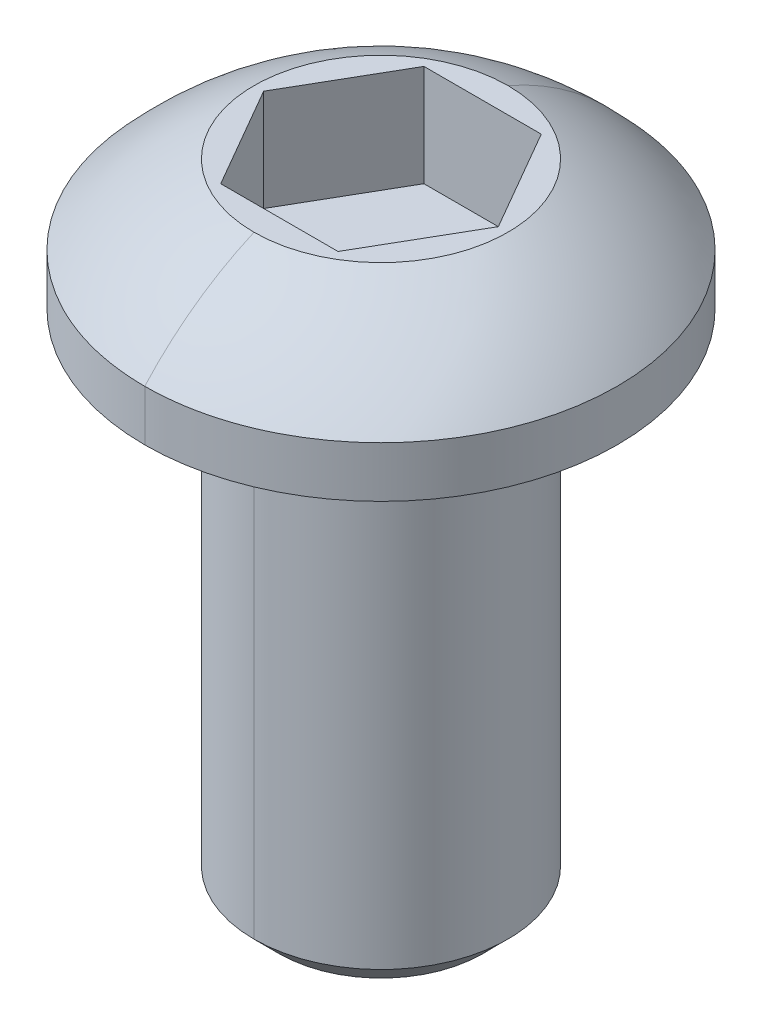
ISO-10303-21;
HEADER;
FILE_DESCRIPTION(('STEP AP214'),'2;1');
FILE_NAME('part.step','',(''),(''),'','','');
FILE_SCHEMA(('AUTOMOTIVE_DESIGN { 1 0 10303 214 1 1 1 1 }'));
ENDSEC;
DATA;
#1=APPLICATION_CONTEXT('core data for automotive mechanical design processes');
#2=APPLICATION_PROTOCOL_DEFINITION('international standard','automotive_design',2000,#1);
#3=PRODUCT_CONTEXT('',#1,'mechanical');
#4=PRODUCT('Part','Part','',(#3));
#5=PRODUCT_RELATED_PRODUCT_CATEGORY('part','',(#4));
#6=PRODUCT_DEFINITION_FORMATION('','',#4);
#7=PRODUCT_DEFINITION_CONTEXT('part definition',#1,'design');
#8=PRODUCT_DEFINITION('design','',#6,#7);
#9=PRODUCT_DEFINITION_SHAPE('','',#8);
#10=(LENGTH_UNIT() NAMED_UNIT(*) SI_UNIT(.MILLI.,.METRE.));
#11=(NAMED_UNIT(*) PLANE_ANGLE_UNIT() SI_UNIT($,.RADIAN.));
#12=(NAMED_UNIT(*) SI_UNIT($,.STERADIAN.) SOLID_ANGLE_UNIT());
#13=UNCERTAINTY_MEASURE_WITH_UNIT(LENGTH_MEASURE(1.E-05),#10,'distance_accuracy_value','');
#14=(GEOMETRIC_REPRESENTATION_CONTEXT(3) GLOBAL_UNCERTAINTY_ASSIGNED_CONTEXT((#13)) GLOBAL_UNIT_ASSIGNED_CONTEXT((#10,
#11,#12)) REPRESENTATION_CONTEXT('',''));
#15=CARTESIAN_POINT('',(0.,0.,0.));
#16=DIRECTION('',(0.,0.,1.));
#17=DIRECTION('',(1.,0.,0.));
#18=AXIS2_PLACEMENT_3D('',#15,#16,#17);
#19=CARTESIAN_POINT('',(2.3094010767585,10.55,0.));
#20=DIRECTION('',(0.,1.,0.));
#21=DIRECTION('',(0.,0.,1.));
#22=AXIS2_PLACEMENT_3D('',#19,#20,#21);
#23=PLANE('',#22);
#24=DIRECTION('',(-1.,0.,0.));
#25=VECTOR('',#24,1.);
#26=CARTESIAN_POINT('',(1.15470053837925,10.55,-2.));
#27=LINE('',#26,#25);
#28=CARTESIAN_POINT('',(1.15470053837925,10.55,-2.));
#29=VERTEX_POINT('',#28);
#30=CARTESIAN_POINT('',(-1.15470053837925,10.55,-2.));
#31=VERTEX_POINT('',#30);
#32=EDGE_CURVE('E168',#29,#31,#27,.T.);
#33=ORIENTED_EDGE('',*,*,#32,.T.);
#34=DIRECTION('',(-0.5,0.,0.866025403784439));
#35=VECTOR('',#34,1.);
#36=CARTESIAN_POINT('',(-1.15470053837925,10.55,-2.));
#37=LINE('',#36,#35);
#38=CARTESIAN_POINT('',(-2.3094010767585,10.55,0.));
#39=VERTEX_POINT('',#38);
#40=EDGE_CURVE('E147',#31,#39,#37,.T.);
#41=ORIENTED_EDGE('',*,*,#40,.T.);
#42=DIRECTION('',(0.5,0.,0.866025403784438));
#43=VECTOR('',#42,1.);
#44=CARTESIAN_POINT('',(-2.3094010767585,10.55,0.));
#45=LINE('',#44,#43);
#46=CARTESIAN_POINT('',(-1.15470053837925,10.55,2.));
#47=VERTEX_POINT('',#46);
#48=EDGE_CURVE('E154',#39,#47,#45,.T.);
#49=ORIENTED_EDGE('',*,*,#48,.T.);
#50=DIRECTION('',(1.,0.,0.));
#51=VECTOR('',#50,1.);
#52=CARTESIAN_POINT('',(-1.15470053837925,10.55,2.));
#53=LINE('',#52,#51);
#54=CARTESIAN_POINT('',(1.15470053837925,10.55,2.));
#55=VERTEX_POINT('',#54);
#56=EDGE_CURVE('E158',#47,#55,#53,.T.);
#57=ORIENTED_EDGE('',*,*,#56,.T.);
#58=DIRECTION('',(0.5,0.,-0.866025403784439));
#59=VECTOR('',#58,1.);
#60=CARTESIAN_POINT('',(1.15470053837925,10.55,2.));
#61=LINE('',#60,#59);
#62=CARTESIAN_POINT('',(2.3094010767585,10.55,0.));
#63=VERTEX_POINT('',#62);
#64=EDGE_CURVE('E162',#55,#63,#61,.T.);
#65=ORIENTED_EDGE('',*,*,#64,.T.);
#66=DIRECTION('',(-0.5,0.,-0.866025403784438));
#67=VECTOR('',#66,1.);
#68=CARTESIAN_POINT('',(2.3094010767585,10.55,0.));
#69=LINE('',#68,#67);
#70=EDGE_CURVE('E166',#63,#29,#69,.T.);
#71=ORIENTED_EDGE('',*,*,#70,.T.);
#72=EDGE_LOOP('',(#33,#41,#49,#57,#65,#71));
#73=FACE_BOUND('',#72,.T.);
#74=ADVANCED_FACE('F17',(#73),#23,.T.);
#75=CARTESIAN_POINT('',(1.15470053837925,10.55,-2.));
#76=DIRECTION('',(0.,0.,-1.));
#77=DIRECTION('',(-1.,0.,0.));
#78=AXIS2_PLACEMENT_3D('',#75,#76,#77);
#79=PLANE('',#78);
#80=ORIENTED_EDGE('',*,*,#32,.F.);
#81=DIRECTION('',(0.,1.,0.));
#82=VECTOR('',#81,1.);
#83=CARTESIAN_POINT('',(1.15470053837925,10.55,-2.));
#84=LINE('',#83,#82);
#85=CARTESIAN_POINT('',(1.15470053837925,12.55,-2.));
#86=VERTEX_POINT('',#85);
#87=EDGE_CURVE('E164',#29,#86,#84,.T.);
#88=ORIENTED_EDGE('',*,*,#87,.T.);
#89=DIRECTION('',(1.,0.,0.));
#90=VECTOR('',#89,1.);
#91=CARTESIAN_POINT('',(0.,12.55,-2.));
#92=LINE('',#91,#90);
#93=CARTESIAN_POINT('',(-1.15470053837925,12.55,-2.));
#94=VERTEX_POINT('',#93);
#95=EDGE_CURVE('E142',#94,#86,#92,.T.);
#96=ORIENTED_EDGE('',*,*,#95,.F.);
#97=DIRECTION('',(0.,1.,0.));
#98=VECTOR('',#97,1.);
#99=CARTESIAN_POINT('',(-1.15470053837925,10.55,-2.));
#100=LINE('',#99,#98);
#101=EDGE_CURVE('E149',#94,#31,#100,.F.);
#102=ORIENTED_EDGE('',*,*,#101,.T.);
#103=EDGE_LOOP('',(#80,#88,#96,#102));
#104=FACE_BOUND('',#103,.T.);
#105=ADVANCED_FACE('F355',(#104),#79,.F.);
#106=CARTESIAN_POINT('',(2.3094010767585,10.55,0.));
#107=DIRECTION('',(0.866025403784438,0.,-0.5));
#108=DIRECTION('',(-0.5,0.,-0.866025403784438));
#109=AXIS2_PLACEMENT_3D('',#106,#107,#108);
#110=PLANE('',#109);
#111=ORIENTED_EDGE('',*,*,#70,.F.);
#112=DIRECTION('',(0.,1.,0.));
#113=VECTOR('',#112,1.);
#114=CARTESIAN_POINT('',(2.3094010767585,10.55,0.));
#115=LINE('',#114,#113);
#116=CARTESIAN_POINT('',(2.3094010767585,12.55,0.));
#117=VERTEX_POINT('',#116);
#118=EDGE_CURVE('E160',#63,#117,#115,.T.);
#119=ORIENTED_EDGE('',*,*,#118,.T.);
#120=DIRECTION('',(0.5,0.,0.866025403784438));
#121=VECTOR('',#120,1.);
#122=CARTESIAN_POINT('',(1.15470053837925,12.55,-2.));
#123=LINE('',#122,#121);
#124=EDGE_CURVE('E139',#86,#117,#123,.T.);
#125=ORIENTED_EDGE('',*,*,#124,.F.);
#126=ORIENTED_EDGE('',*,*,#87,.F.);
#127=EDGE_LOOP('',(#111,#119,#125,#126));
#128=FACE_BOUND('',#127,.T.);
#129=ADVANCED_FACE('F346',(#128),#110,.F.);
#130=CARTESIAN_POINT('',(1.15470053837925,10.55,2.));
#131=DIRECTION('',(0.866025403784439,0.,0.5));
#132=DIRECTION('',(0.5,0.,-0.866025403784439));
#133=AXIS2_PLACEMENT_3D('',#130,#131,#132);
#134=PLANE('',#133);
#135=ORIENTED_EDGE('',*,*,#64,.F.);
#136=DIRECTION('',(0.,1.,0.));
#137=VECTOR('',#136,1.);
#138=CARTESIAN_POINT('',(1.15470053837925,10.55,2.));
#139=LINE('',#138,#137);
#140=CARTESIAN_POINT('',(1.15470053837925,12.55,2.));
#141=VERTEX_POINT('',#140);
#142=EDGE_CURVE('E156',#55,#141,#139,.T.);
#143=ORIENTED_EDGE('',*,*,#142,.T.);
#144=DIRECTION('',(-0.5,0.,0.866025403784438));
#145=VECTOR('',#144,1.);
#146=CARTESIAN_POINT('',(2.3094010767585,12.55,0.));
#147=LINE('',#146,#145);
#148=EDGE_CURVE('E136',#117,#141,#147,.T.);
#149=ORIENTED_EDGE('',*,*,#148,.F.);
#150=ORIENTED_EDGE('',*,*,#118,.F.);
#151=EDGE_LOOP('',(#135,#143,#149,#150));
#152=FACE_BOUND('',#151,.T.);
#153=ADVANCED_FACE('F337',(#152),#134,.F.);
#154=CARTESIAN_POINT('',(-1.15470053837925,10.55,2.));
#155=DIRECTION('',(0.,0.,1.));
#156=DIRECTION('',(1.,0.,0.));
#157=AXIS2_PLACEMENT_3D('',#154,#155,#156);
#158=PLANE('',#157);
#159=ORIENTED_EDGE('',*,*,#56,.F.);
#160=DIRECTION('',(0.,1.,0.));
#161=VECTOR('',#160,1.);
#162=CARTESIAN_POINT('',(-1.15470053837925,10.55,2.));
#163=LINE('',#162,#161);
#164=CARTESIAN_POINT('',(-1.15470053837925,12.55,2.));
#165=VERTEX_POINT('',#164);
#166=EDGE_CURVE('E152',#47,#165,#163,.T.);
#167=ORIENTED_EDGE('',*,*,#166,.T.);
#168=DIRECTION('',(1.,0.,0.));
#169=VECTOR('',#168,1.);
#170=CARTESIAN_POINT('',(0.,12.55,2.));
#171=LINE('',#170,#169);
#172=EDGE_CURVE('E133',#141,#165,#171,.F.);
#173=ORIENTED_EDGE('',*,*,#172,.F.);
#174=ORIENTED_EDGE('',*,*,#142,.F.);
#175=EDGE_LOOP('',(#159,#167,#173,#174));
#176=FACE_BOUND('',#175,.T.);
#177=ADVANCED_FACE('F328',(#176),#158,.F.);
#178=CARTESIAN_POINT('',(-2.3094010767585,10.55,0.));
#179=DIRECTION('',(-0.866025403784438,0.,0.5));
#180=DIRECTION('',(0.5,0.,0.866025403784438));
#181=AXIS2_PLACEMENT_3D('',#178,#179,#180);
#182=PLANE('',#181);
#183=ORIENTED_EDGE('',*,*,#48,.F.);
#184=DIRECTION('',(0.,1.,0.));
#185=VECTOR('',#184,1.);
#186=CARTESIAN_POINT('',(-2.3094010767585,10.55,0.));
#187=LINE('',#186,#185);
#188=CARTESIAN_POINT('',(-2.3094010767585,12.55,0.));
#189=VERTEX_POINT('',#188);
#190=EDGE_CURVE('E145',#39,#189,#187,.T.);
#191=ORIENTED_EDGE('',*,*,#190,.T.);
#192=DIRECTION('',(-0.5,0.,-0.866025403784438));
#193=VECTOR('',#192,1.);
#194=CARTESIAN_POINT('',(-1.15470053837925,12.55,2.));
#195=LINE('',#194,#193);
#196=EDGE_CURVE('E130',#165,#189,#195,.T.);
#197=ORIENTED_EDGE('',*,*,#196,.F.);
#198=ORIENTED_EDGE('',*,*,#166,.F.);
#199=EDGE_LOOP('',(#183,#191,#197,#198));
#200=FACE_BOUND('',#199,.T.);
#201=ADVANCED_FACE('F319',(#200),#182,.F.);
#202=CARTESIAN_POINT('',(-1.15470053837925,10.55,-2.));
#203=DIRECTION('',(-0.866025403784439,0.,-0.5));
#204=DIRECTION('',(-0.5,0.,0.866025403784439));
#205=AXIS2_PLACEMENT_3D('',#202,#203,#204);
#206=PLANE('',#205);
#207=ORIENTED_EDGE('',*,*,#40,.F.);
#208=ORIENTED_EDGE('',*,*,#101,.F.);
#209=DIRECTION('',(0.5,0.,-0.866025403784439));
#210=VECTOR('',#209,1.);
#211=CARTESIAN_POINT('',(-2.3094010767585,12.55,0.));
#212=LINE('',#211,#210);
#213=EDGE_CURVE('E113',#189,#94,#212,.T.);
#214=ORIENTED_EDGE('',*,*,#213,.F.);
#215=ORIENTED_EDGE('',*,*,#190,.F.);
#216=EDGE_LOOP('',(#207,#208,#214,#215));
#217=FACE_BOUND('',#216,.T.);
#218=ADVANCED_FACE('F310',(#217),#206,.F.);
#219=CARTESIAN_POINT('',(0.,12.55,0.));
#220=DIRECTION('',(0.,1.,0.));
#221=DIRECTION('',(0.,0.,1.));
#222=AXIS2_PLACEMENT_3D('',#219,#220,#221);
#223=PLANE('',#222);
#224=ORIENTED_EDGE('',*,*,#196,.T.);
#225=ORIENTED_EDGE('',*,*,#213,.T.);
#226=ORIENTED_EDGE('',*,*,#95,.T.);
#227=ORIENTED_EDGE('',*,*,#124,.T.);
#228=ORIENTED_EDGE('',*,*,#148,.T.);
#229=ORIENTED_EDGE('',*,*,#172,.T.);
#230=EDGE_LOOP('',(#224,#225,#226,#227,#228,#229));
#231=FACE_BOUND('',#230,.T.);
#232=CARTESIAN_POINT('',(0.,12.55,0.));
#233=DIRECTION('',(0.,1.,0.));
#234=DIRECTION('',(0.,0.,1.));
#235=AXIS2_PLACEMENT_3D('',#232,#233,#234);
#236=CIRCLE('',#235,2.5);
#237=CARTESIAN_POINT('',(0.,12.55,2.5));
#238=VERTEX_POINT('',#237);
#239=CARTESIAN_POINT('',(0.,12.55,-2.5));
#240=VERTEX_POINT('',#239);
#241=EDGE_CURVE('E114',#238,#240,#236,.F.);
#242=ORIENTED_EDGE('',*,*,#241,.F.);
#243=CARTESIAN_POINT('',(0.,12.55,0.));
#244=DIRECTION('',(0.,1.,0.));
#245=DIRECTION('',(0.,0.,1.));
#246=AXIS2_PLACEMENT_3D('',#243,#244,#245);
#247=CIRCLE('',#246,2.5);
#248=EDGE_CURVE('E21',#240,#238,#247,.F.);
#249=ORIENTED_EDGE('',*,*,#248,.F.);
#250=EDGE_LOOP('',(#242,#249));
#251=FACE_BOUND('',#250,.T.);
#252=ADVANCED_FACE('F115',(#231,#251),#223,.T.);
#253=CARTESIAN_POINT('',(0.,6.81612903225806,0.));
#254=DIRECTION('',(0.,0.,-1.));
#255=DIRECTION('',(0.,1.,0.));
#256=AXIS2_PLACEMENT_3D('',#253,#254,#255);
#257=SPHERICAL_SURFACE('',#256,6.25517995542205);
#258=ORIENTED_EDGE('',*,*,#248,.T.);
#259=CARTESIAN_POINT('',(0.,6.81612903225807,0.));
#260=DIRECTION('',(-1.,0.,0.));
#261=DIRECTION('',(0.,0.,1.));
#262=AXIS2_PLACEMENT_3D('',#259,#260,#261);
#263=CIRCLE('',#262,6.25517995542205);
#264=CARTESIAN_POINT('',(0.,11.,4.65));
#265=VERTEX_POINT('',#264);
#266=EDGE_CURVE('E108',#265,#238,#263,.T.);
#267=ORIENTED_EDGE('',*,*,#266,.F.);
#268=CARTESIAN_POINT('',(0.,11.,0.));
#269=DIRECTION('',(0.,-1.,0.));
#270=DIRECTION('',(0.,0.,-1.));
#271=AXIS2_PLACEMENT_3D('',#268,#269,#270);
#272=CIRCLE('',#271,4.65);
#273=CARTESIAN_POINT('',(0.,11.,-4.65));
#274=VERTEX_POINT('',#273);
#275=EDGE_CURVE('E117',#274,#265,#272,.T.);
#276=ORIENTED_EDGE('',*,*,#275,.F.);
#277=CARTESIAN_POINT('',(0.,6.81612903225807,0.));
#278=DIRECTION('',(-1.,0.,0.));
#279=DIRECTION('',(0.,0.,1.));
#280=AXIS2_PLACEMENT_3D('',#277,#278,#279);
#281=CIRCLE('',#280,6.25517995542205);
#282=EDGE_CURVE('E111',#240,#274,#281,.T.);
#283=ORIENTED_EDGE('',*,*,#282,.F.);
#284=EDGE_LOOP('',(#258,#267,#276,#283));
#285=FACE_BOUND('',#284,.T.);
#286=ADVANCED_FACE('F106',(#285),#257,.T.);
#287=CARTESIAN_POINT('',(0.,6.81612903225806,0.));
#288=DIRECTION('',(0.,0.,-1.));
#289=DIRECTION('',(-0.747882256139405,0.663831402505059,0.));
#290=AXIS2_PLACEMENT_3D('',#287,#288,#289);
#291=SPHERICAL_SURFACE('',#290,6.25517995542205);
#292=ORIENTED_EDGE('',*,*,#266,.T.);
#293=ORIENTED_EDGE('',*,*,#241,.T.);
#294=ORIENTED_EDGE('',*,*,#282,.T.);
#295=CARTESIAN_POINT('',(0.,11.,0.));
#296=DIRECTION('',(0.,-1.,0.));
#297=DIRECTION('',(0.,0.,-1.));
#298=AXIS2_PLACEMENT_3D('',#295,#296,#297);
#299=CIRCLE('',#298,4.65);
#300=EDGE_CURVE('E120',#265,#274,#299,.T.);
#301=ORIENTED_EDGE('',*,*,#300,.F.);
#302=EDGE_LOOP('',(#292,#293,#294,#301));
#303=FACE_BOUND('',#302,.T.);
#304=ADVANCED_FACE('F19',(#303),#291,.T.);
#305=CARTESIAN_POINT('',(0.,0.,0.));
#306=DIRECTION('',(0.,-1.,0.));
#307=DIRECTION('',(0.,0.,-1.));
#308=AXIS2_PLACEMENT_3D('',#305,#306,#307);
#309=CYLINDRICAL_SURFACE('',#308,4.65);
#310=CARTESIAN_POINT('',(0.,10.,0.));
#311=DIRECTION('',(0.,-1.,0.));
#312=DIRECTION('',(0.,0.,-1.));
#313=AXIS2_PLACEMENT_3D('',#310,#311,#312);
#314=CIRCLE('',#313,4.65);
#315=CARTESIAN_POINT('',(0.,10.,-4.65));
#316=VERTEX_POINT('',#315);
#317=CARTESIAN_POINT('',(0.,10.,4.65));
#318=VERTEX_POINT('',#317);
#319=EDGE_CURVE('E185',#316,#318,#314,.T.);
#320=ORIENTED_EDGE('',*,*,#319,.F.);
#321=DIRECTION('',(0.,-1.,0.));
#322=VECTOR('',#321,1.);
#323=CARTESIAN_POINT('',(0.,0.,-4.65));
#324=LINE('',#323,#322);
#325=EDGE_CURVE('E191',#274,#316,#324,.T.);
#326=ORIENTED_EDGE('',*,*,#325,.F.);
#327=ORIENTED_EDGE('',*,*,#275,.T.);
#328=DIRECTION('',(0.,-1.,0.));
#329=VECTOR('',#328,1.);
#330=CARTESIAN_POINT('',(0.,0.,4.65));
#331=LINE('',#330,#329);
#332=EDGE_CURVE('E125',#318,#265,#331,.F.);
#333=ORIENTED_EDGE('',*,*,#332,.F.);
#334=EDGE_LOOP('',(#320,#326,#327,#333));
#335=FACE_BOUND('',#334,.T.);
#336=ADVANCED_FACE('F199',(#335),#309,.T.);
#337=CARTESIAN_POINT('',(0.,0.,0.));
#338=DIRECTION('',(0.,-1.,0.));
#339=DIRECTION('',(0.,0.,-1.));
#340=AXIS2_PLACEMENT_3D('',#337,#338,#339);
#341=CYLINDRICAL_SURFACE('',#340,4.65);
#342=ORIENTED_EDGE('',*,*,#325,.T.);
#343=CARTESIAN_POINT('',(0.,10.,0.));
#344=DIRECTION('',(0.,-1.,0.));
#345=DIRECTION('',(0.,0.,-1.));
#346=AXIS2_PLACEMENT_3D('',#343,#344,#345);
#347=CIRCLE('',#346,4.65);
#348=EDGE_CURVE('E182',#318,#316,#347,.T.);
#349=ORIENTED_EDGE('',*,*,#348,.F.);
#350=ORIENTED_EDGE('',*,*,#332,.T.);
#351=ORIENTED_EDGE('',*,*,#300,.T.);
#352=EDGE_LOOP('',(#342,#349,#350,#351));
#353=FACE_BOUND('',#352,.T.);
#354=ADVANCED_FACE('F198',(#353),#341,.T.);
#355=CARTESIAN_POINT('',(0.,0.,0.));
#356=DIRECTION('',(0.,-1.,0.));
#357=DIRECTION('',(0.,0.,-1.));
#358=AXIS2_PLACEMENT_3D('',#355,#356,#357);
#359=PLANE('',#358);
#360=CARTESIAN_POINT('',(0.,0.,0.));
#361=DIRECTION('',(0.,1.,0.));
#362=DIRECTION('',(0.,0.,1.));
#363=AXIS2_PLACEMENT_3D('',#360,#361,#362);
#364=CIRCLE('',#363,1.99999999995271);
#365=CARTESIAN_POINT('',(0.,0.,1.99999999995271));
#366=VERTEX_POINT('',#365);
#367=CARTESIAN_POINT('',(0.,0.,-1.99999999995271));
#368=VERTEX_POINT('',#367);
#369=EDGE_CURVE('E178',#366,#368,#364,.T.);
#370=ORIENTED_EDGE('',*,*,#369,.F.);
#371=CARTESIAN_POINT('',(0.,0.,0.));
#372=DIRECTION('',(0.,1.,0.));
#373=DIRECTION('',(0.,0.,1.));
#374=AXIS2_PLACEMENT_3D('',#371,#372,#373);
#375=CIRCLE('',#374,1.99999999995271);
#376=EDGE_CURVE('E188',#368,#366,#375,.T.);
#377=ORIENTED_EDGE('',*,*,#376,.F.);
#378=EDGE_LOOP('',(#370,#377));
#379=FACE_BOUND('',#378,.T.);
#380=ADVANCED_FACE('F224',(#379),#359,.T.);
#381=CARTESIAN_POINT('',(0.,0.499999999988177,0.));
#382=DIRECTION('',(0.,1.,0.));
#383=DIRECTION('',(0.,0.,1.));
#384=AXIS2_PLACEMENT_3D('',#381,#382,#383);
#385=CONICAL_SURFACE('',#384,2.49999999999773,0.785398163454292);
#386=DIRECTION('',(0.,-0.707106781186548,-0.707106781186547));
#387=VECTOR('',#386,1.);
#388=CARTESIAN_POINT('',(0.,498998.,499000.));
#389=LINE('',#388,#387);
#390=CARTESIAN_POINT('',(0.,0.499999999992611,2.49999999999858));
#391=VERTEX_POINT('',#390);
#392=EDGE_CURVE('E177',#391,#366,#389,.T.);
#393=ORIENTED_EDGE('',*,*,#392,.F.);
#394=CARTESIAN_POINT('',(0.,0.5,0.));
#395=DIRECTION('',(0.,-1.,0.));
#396=DIRECTION('',(0.,0.,-1.));
#397=AXIS2_PLACEMENT_3D('',#394,#395,#396);
#398=CIRCLE('',#397,2.5);
#399=CARTESIAN_POINT('',(0.,0.499999999991133,-2.49999999999829));
#400=VERTEX_POINT('',#399);
#401=EDGE_CURVE('E36',#400,#391,#398,.F.);
#402=ORIENTED_EDGE('',*,*,#401,.F.);
#403=DIRECTION('',(0.,-0.707106781186548,0.707106781186547));
#404=VECTOR('',#403,1.);
#405=CARTESIAN_POINT('',(6.11098752774529E-11,498998.,-499000.));
#406=LINE('',#405,#404);
#407=EDGE_CURVE('E181',#368,#400,#406,.F.);
#408=ORIENTED_EDGE('',*,*,#407,.F.);
#409=ORIENTED_EDGE('',*,*,#376,.T.);
#410=EDGE_LOOP('',(#393,#402,#408,#409));
#411=FACE_BOUND('',#410,.T.);
#412=ADVANCED_FACE('F205',(#411),#385,.T.);
#413=CARTESIAN_POINT('',(0.,10.,-2.5));
#414=DIRECTION('',(0.,-1.,0.));
#415=DIRECTION('',(0.,0.,-1.));
#416=AXIS2_PLACEMENT_3D('',#413,#414,#415);
#417=PLANE('',#416);
#418=ORIENTED_EDGE('',*,*,#319,.T.);
#419=ORIENTED_EDGE('',*,*,#348,.T.);
#420=EDGE_LOOP('',(#418,#419));
#421=FACE_BOUND('',#420,.T.);
#422=CARTESIAN_POINT('',(0.,10.,0.));
#423=DIRECTION('',(0.,-1.,0.));
#424=DIRECTION('',(0.,0.,-1.));
#425=AXIS2_PLACEMENT_3D('',#422,#423,#424);
#426=CIRCLE('',#425,2.5);
#427=CARTESIAN_POINT('',(0.,10.,-2.5));
#428=VERTEX_POINT('',#427);
#429=CARTESIAN_POINT('',(0.,10.,2.5));
#430=VERTEX_POINT('',#429);
#431=EDGE_CURVE('E170',#428,#430,#426,.T.);
#432=ORIENTED_EDGE('',*,*,#431,.F.);
#433=CARTESIAN_POINT('',(0.,10.,0.));
#434=DIRECTION('',(0.,-1.,0.));
#435=DIRECTION('',(0.,0.,-1.));
#436=AXIS2_PLACEMENT_3D('',#433,#434,#435);
#437=CIRCLE('',#436,2.5);
#438=EDGE_CURVE('E174',#430,#428,#437,.T.);
#439=ORIENTED_EDGE('',*,*,#438,.F.);
#440=EDGE_LOOP('',(#432,#439));
#441=FACE_BOUND('',#440,.T.);
#442=ADVANCED_FACE('F201',(#421,#441),#417,.T.);
#443=CARTESIAN_POINT('',(0.,0.499999999988177,0.));
#444=DIRECTION('',(0.,1.,0.));
#445=DIRECTION('',(0.,0.,1.));
#446=AXIS2_PLACEMENT_3D('',#443,#444,#445);
#447=CONICAL_SURFACE('',#446,2.49999999999773,0.785398163454292);
#448=CARTESIAN_POINT('',(0.,0.5,0.));
#449=DIRECTION('',(0.,-1.,0.));
#450=DIRECTION('',(0.,0.,-1.));
#451=AXIS2_PLACEMENT_3D('',#448,#449,#450);
#452=CIRCLE('',#451,2.5);
#453=EDGE_CURVE('E27',#391,#400,#452,.F.);
#454=ORIENTED_EDGE('',*,*,#453,.F.);
#455=ORIENTED_EDGE('',*,*,#392,.T.);
#456=ORIENTED_EDGE('',*,*,#369,.T.);
#457=ORIENTED_EDGE('',*,*,#407,.T.);
#458=EDGE_LOOP('',(#454,#455,#456,#457));
#459=FACE_BOUND('',#458,.T.);
#460=ADVANCED_FACE('F204',(#459),#447,.T.);
#461=CARTESIAN_POINT('',(0.,0.,0.));
#462=DIRECTION('',(0.,-1.,0.));
#463=DIRECTION('',(0.,0.,-1.));
#464=AXIS2_PLACEMENT_3D('',#461,#462,#463);
#465=CYLINDRICAL_SURFACE('',#464,2.5);
#466=DIRECTION('',(0.,-1.,0.));
#467=VECTOR('',#466,1.);
#468=CARTESIAN_POINT('',(0.,0.,-2.5));
#469=LINE('',#468,#467);
#470=EDGE_CURVE('E11',#400,#428,#469,.F.);
#471=ORIENTED_EDGE('',*,*,#470,.F.);
#472=ORIENTED_EDGE('',*,*,#401,.T.);
#473=DIRECTION('',(0.,-1.,0.));
#474=VECTOR('',#473,1.);
#475=CARTESIAN_POINT('',(0.,0.,2.5));
#476=LINE('',#475,#474);
#477=EDGE_CURVE('E173',#430,#391,#476,.T.);
#478=ORIENTED_EDGE('',*,*,#477,.F.);
#479=ORIENTED_EDGE('',*,*,#438,.T.);
#480=EDGE_LOOP('',(#471,#472,#478,#479));
#481=FACE_BOUND('',#480,.T.);
#482=ADVANCED_FACE('F212',(#481),#465,.T.);
#483=CARTESIAN_POINT('',(0.,0.,0.));
#484=DIRECTION('',(0.,-1.,0.));
#485=DIRECTION('',(0.,0.,-1.));
#486=AXIS2_PLACEMENT_3D('',#483,#484,#485);
#487=CYLINDRICAL_SURFACE('',#486,2.5);
#488=ORIENTED_EDGE('',*,*,#453,.T.);
#489=ORIENTED_EDGE('',*,*,#470,.T.);
#490=ORIENTED_EDGE('',*,*,#431,.T.);
#491=ORIENTED_EDGE('',*,*,#477,.T.);
#492=EDGE_LOOP('',(#488,#489,#490,#491));
#493=FACE_BOUND('',#492,.T.);
#494=ADVANCED_FACE('F214',(#493),#487,.T.);
#495=CLOSED_SHELL('',(#74,#105,#129,#153,#177,#201,#218,#252,#286,#304,#336,#354,#380,#412,#442,
#460,#482,#494));
#496=MANIFOLD_SOLID_BREP('B1',#495);
#497=ADVANCED_BREP_SHAPE_REPRESENTATION('',(#18,#496),#14);
#498=SHAPE_DEFINITION_REPRESENTATION(#9,#497);
ENDSEC;
END-ISO-10303-21;
